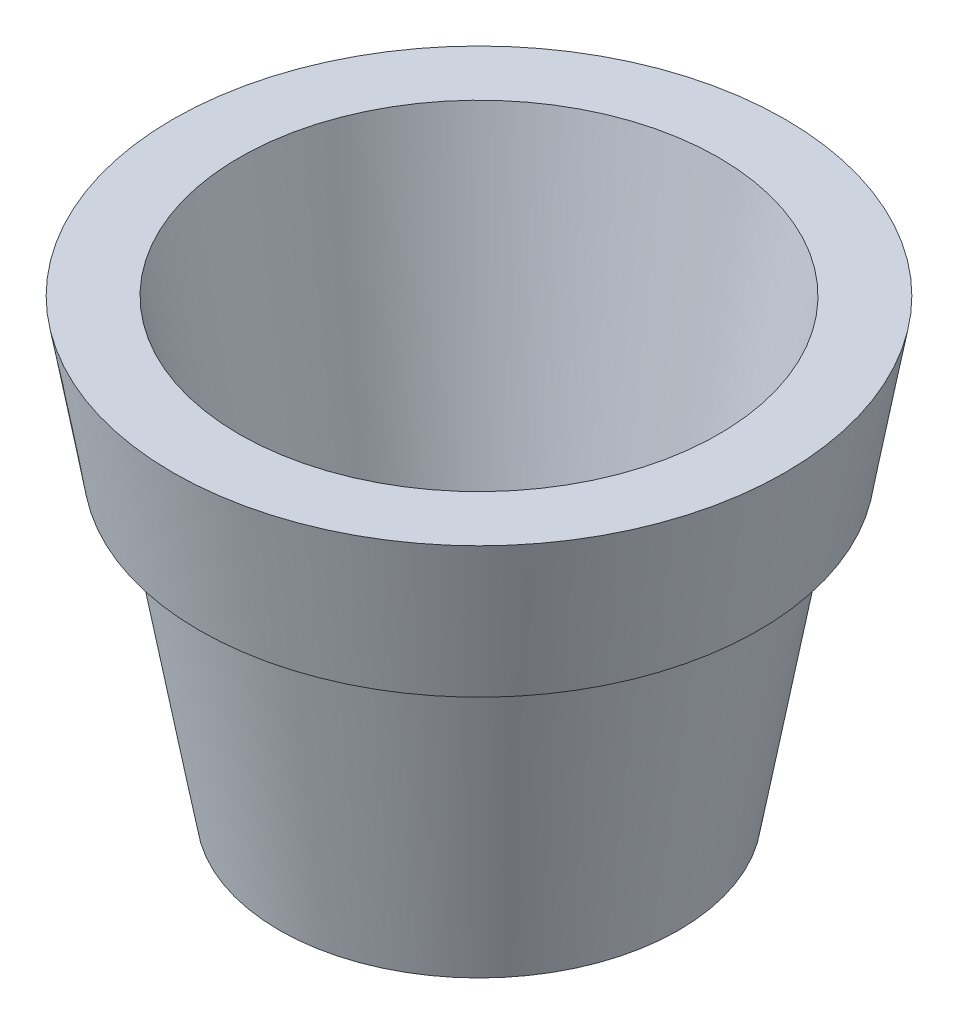
ISO-10303-21;
HEADER;
FILE_DESCRIPTION(('STEP AP214'),'2;1');
FILE_NAME('part.step','',(''),(''),'','','');
FILE_SCHEMA(('AUTOMOTIVE_DESIGN { 1 0 10303 214 1 1 1 1 }'));
ENDSEC;
DATA;
#1=APPLICATION_CONTEXT('core data for automotive mechanical design processes');
#2=APPLICATION_PROTOCOL_DEFINITION('international standard','automotive_design',2000,#1);
#3=PRODUCT_CONTEXT('',#1,'mechanical');
#4=PRODUCT('Part','Part','',(#3));
#5=PRODUCT_RELATED_PRODUCT_CATEGORY('part','',(#4));
#6=PRODUCT_DEFINITION_FORMATION('','',#4);
#7=PRODUCT_DEFINITION_CONTEXT('part definition',#1,'design');
#8=PRODUCT_DEFINITION('design','',#6,#7);
#9=PRODUCT_DEFINITION_SHAPE('','',#8);
#10=(LENGTH_UNIT() NAMED_UNIT(*) SI_UNIT(.MILLI.,.METRE.));
#11=(NAMED_UNIT(*) PLANE_ANGLE_UNIT() SI_UNIT($,.RADIAN.));
#12=(NAMED_UNIT(*) SI_UNIT($,.STERADIAN.) SOLID_ANGLE_UNIT());
#13=UNCERTAINTY_MEASURE_WITH_UNIT(LENGTH_MEASURE(1.E-05),#10,'distance_accuracy_value','');
#14=(GEOMETRIC_REPRESENTATION_CONTEXT(3) GLOBAL_UNCERTAINTY_ASSIGNED_CONTEXT((#13)) GLOBAL_UNIT_ASSIGNED_CONTEXT((#10,
#11,#12)) REPRESENTATION_CONTEXT('',''));
#15=CARTESIAN_POINT('',(0.,0.,0.));
#16=DIRECTION('',(0.,0.,1.));
#17=DIRECTION('',(1.,0.,0.));
#18=AXIS2_PLACEMENT_3D('',#15,#16,#17);
#19=CARTESIAN_POINT('',(0.,0.,0.));
#20=DIRECTION('',(0.,1.,0.));
#21=DIRECTION('',(0.,0.,1.));
#22=AXIS2_PLACEMENT_3D('',#19,#20,#21);
#23=CONICAL_SURFACE('',#22,20.,0.174532925199433);
#24=CARTESIAN_POINT('',(0.,30.,0.));
#25=DIRECTION('',(0.,1.,0.));
#26=DIRECTION('',(0.,0.,1.));
#27=AXIS2_PLACEMENT_3D('',#24,#25,#26);
#28=CIRCLE('',#27,25.289809421254);
#29=CARTESIAN_POINT('',(0.,30.,25.289809421254));
#30=VERTEX_POINT('',#29);
#31=EDGE_CURVE('E10',#30,#30,#28,.T.);
#32=ORIENTED_EDGE('',*,*,#31,.F.);
#33=EDGE_LOOP('',(#32));
#34=FACE_BOUND('',#33,.T.);
#35=CARTESIAN_POINT('',(0.,0.,0.));
#36=DIRECTION('',(0.,1.,0.));
#37=DIRECTION('',(0.,0.,1.));
#38=AXIS2_PLACEMENT_3D('',#35,#36,#37);
#39=CIRCLE('',#38,20.);
#40=CARTESIAN_POINT('',(0.,0.,20.));
#41=VERTEX_POINT('',#40);
#42=EDGE_CURVE('E41',#41,#41,#39,.T.);
#43=ORIENTED_EDGE('',*,*,#42,.T.);
#44=EDGE_LOOP('',(#43));
#45=FACE_BOUND('',#44,.T.);
#46=ADVANCED_FACE('F35',(#34,#45),#23,.T.);
#47=CARTESIAN_POINT('',(0.,0.,0.));
#48=DIRECTION('',(0.,1.,0.));
#49=DIRECTION('',(0.,0.,1.));
#50=AXIS2_PLACEMENT_3D('',#47,#48,#49);
#51=PLANE('',#50);
#52=CARTESIAN_POINT('',(0.,0.,0.));
#53=DIRECTION('',(0.,1.,0.));
#54=DIRECTION('',(0.,0.,1.));
#55=AXIS2_PLACEMENT_3D('',#52,#53,#54);
#56=CIRCLE('',#55,4.);
#57=CARTESIAN_POINT('',(0.,0.,4.));
#58=VERTEX_POINT('',#57);
#59=EDGE_CURVE('E60',#58,#58,#56,.F.);
#60=ORIENTED_EDGE('',*,*,#59,.F.);
#61=EDGE_LOOP('',(#60));
#62=FACE_BOUND('',#61,.T.);
#63=ORIENTED_EDGE('',*,*,#42,.F.);
#64=EDGE_LOOP('',(#63));
#65=FACE_BOUND('',#64,.T.);
#66=ADVANCED_FACE('F92',(#62,#65),#51,.F.);
#67=CARTESIAN_POINT('',(0.,30.,0.));
#68=DIRECTION('',(0.,1.,0.));
#69=DIRECTION('',(0.,0.,1.));
#70=AXIS2_PLACEMENT_3D('',#67,#68,#69);
#71=CONICAL_SURFACE('',#70,28.,0.174532925199433);
#72=CARTESIAN_POINT('',(0.,45.,0.));
#73=DIRECTION('',(0.,1.,0.));
#74=DIRECTION('',(0.,0.,1.));
#75=AXIS2_PLACEMENT_3D('',#72,#73,#74);
#76=CIRCLE('',#75,30.644904710627);
#77=CARTESIAN_POINT('',(0.,45.,30.644904710627));
#78=VERTEX_POINT('',#77);
#79=EDGE_CURVE('E45',#78,#78,#76,.T.);
#80=ORIENTED_EDGE('',*,*,#79,.F.);
#81=EDGE_LOOP('',(#80));
#82=FACE_BOUND('',#81,.T.);
#83=CARTESIAN_POINT('',(0.,30.,0.));
#84=DIRECTION('',(0.,1.,0.));
#85=DIRECTION('',(0.,0.,1.));
#86=AXIS2_PLACEMENT_3D('',#83,#84,#85);
#87=CIRCLE('',#86,28.);
#88=CARTESIAN_POINT('',(0.,30.,28.));
#89=VERTEX_POINT('',#88);
#90=EDGE_CURVE('E49',#89,#89,#87,.T.);
#91=ORIENTED_EDGE('',*,*,#90,.T.);
#92=EDGE_LOOP('',(#91));
#93=FACE_BOUND('',#92,.T.);
#94=ADVANCED_FACE('F86',(#82,#93),#71,.T.);
#95=CARTESIAN_POINT('',(0.,45.,0.));
#96=DIRECTION('',(0.,1.,0.));
#97=DIRECTION('',(0.,0.,1.));
#98=AXIS2_PLACEMENT_3D('',#95,#96,#97);
#99=PLANE('',#98);
#100=CARTESIAN_POINT('',(0.,45.,0.));
#101=DIRECTION('',(0.,1.,0.));
#102=DIRECTION('',(0.,0.,1.));
#103=AXIS2_PLACEMENT_3D('',#100,#101,#102);
#104=CIRCLE('',#103,24.);
#105=CARTESIAN_POINT('',(0.,45.,24.));
#106=VERTEX_POINT('',#105);
#107=EDGE_CURVE('E57',#106,#106,#104,.T.);
#108=ORIENTED_EDGE('',*,*,#107,.F.);
#109=EDGE_LOOP('',(#108));
#110=FACE_BOUND('',#109,.T.);
#111=ORIENTED_EDGE('',*,*,#79,.T.);
#112=EDGE_LOOP('',(#111));
#113=FACE_BOUND('',#112,.T.);
#114=ADVANCED_FACE('F83',(#110,#113),#99,.T.);
#115=CARTESIAN_POINT('',(0.,30.,0.));
#116=DIRECTION('',(0.,1.,0.));
#117=DIRECTION('',(0.,0.,1.));
#118=AXIS2_PLACEMENT_3D('',#115,#116,#117);
#119=PLANE('',#118);
#120=ORIENTED_EDGE('',*,*,#31,.T.);
#121=EDGE_LOOP('',(#120));
#122=FACE_BOUND('',#121,.T.);
#123=ORIENTED_EDGE('',*,*,#90,.F.);
#124=EDGE_LOOP('',(#123));
#125=FACE_BOUND('',#124,.T.);
#126=ADVANCED_FACE('F79',(#122,#125),#119,.F.);
#127=CARTESIAN_POINT('',(0.,45.,0.));
#128=DIRECTION('',(0.,1.,0.));
#129=DIRECTION('',(0.,0.,1.));
#130=AXIS2_PLACEMENT_3D('',#127,#128,#129);
#131=CONICAL_SURFACE('',#130,24.,0.174532925199433);
#132=CARTESIAN_POINT('',(0.,5.,0.));
#133=DIRECTION('',(0.,1.,0.));
#134=DIRECTION('',(0.,0.,1.));
#135=AXIS2_PLACEMENT_3D('',#132,#133,#134);
#136=CIRCLE('',#135,16.9469207716614);
#137=CARTESIAN_POINT('',(0.,5.,16.9469207716614));
#138=VERTEX_POINT('',#137);
#139=EDGE_CURVE('E54',#138,#138,#136,.T.);
#140=ORIENTED_EDGE('',*,*,#139,.F.);
#141=EDGE_LOOP('',(#140));
#142=FACE_BOUND('',#141,.T.);
#143=ORIENTED_EDGE('',*,*,#107,.T.);
#144=EDGE_LOOP('',(#143));
#145=FACE_BOUND('',#144,.T.);
#146=ADVANCED_FACE('F73',(#142,#145),#131,.F.);
#147=CARTESIAN_POINT('',(0.,5.,0.));
#148=DIRECTION('',(0.,1.,0.));
#149=DIRECTION('',(0.,0.,1.));
#150=AXIS2_PLACEMENT_3D('',#147,#148,#149);
#151=PLANE('',#150);
#152=CARTESIAN_POINT('',(0.,5.,0.));
#153=DIRECTION('',(0.,1.,0.));
#154=DIRECTION('',(0.,0.,1.));
#155=AXIS2_PLACEMENT_3D('',#152,#153,#154);
#156=CIRCLE('',#155,4.);
#157=CARTESIAN_POINT('',(0.,5.,4.));
#158=VERTEX_POINT('',#157);
#159=EDGE_CURVE('E63',#158,#158,#156,.T.);
#160=ORIENTED_EDGE('',*,*,#159,.F.);
#161=EDGE_LOOP('',(#160));
#162=FACE_BOUND('',#161,.T.);
#163=ORIENTED_EDGE('',*,*,#139,.T.);
#164=EDGE_LOOP('',(#163));
#165=FACE_BOUND('',#164,.T.);
#166=ADVANCED_FACE('F70',(#162,#165),#151,.T.);
#167=CARTESIAN_POINT('',(0.,-0.00100000000000013,0.));
#168=DIRECTION('',(0.,1.,0.));
#169=DIRECTION('',(0.,0.,1.));
#170=AXIS2_PLACEMENT_3D('',#167,#168,#169);
#171=CYLINDRICAL_SURFACE('',#170,4.);
#172=ORIENTED_EDGE('',*,*,#159,.T.);
#173=EDGE_LOOP('',(#172));
#174=FACE_BOUND('',#173,.T.);
#175=ORIENTED_EDGE('',*,*,#59,.T.);
#176=EDGE_LOOP('',(#175));
#177=FACE_BOUND('',#176,.T.);
#178=ADVANCED_FACE('F67',(#174,#177),#171,.F.);
#179=CLOSED_SHELL('',(#46,#66,#94,#114,#126,#146,#166,#178));
#180=MANIFOLD_SOLID_BREP('B2',#179);
#181=ADVANCED_BREP_SHAPE_REPRESENTATION('',(#18,#180),#14);
#182=SHAPE_DEFINITION_REPRESENTATION(#9,#181);
ENDSEC;
END-ISO-10303-21;
